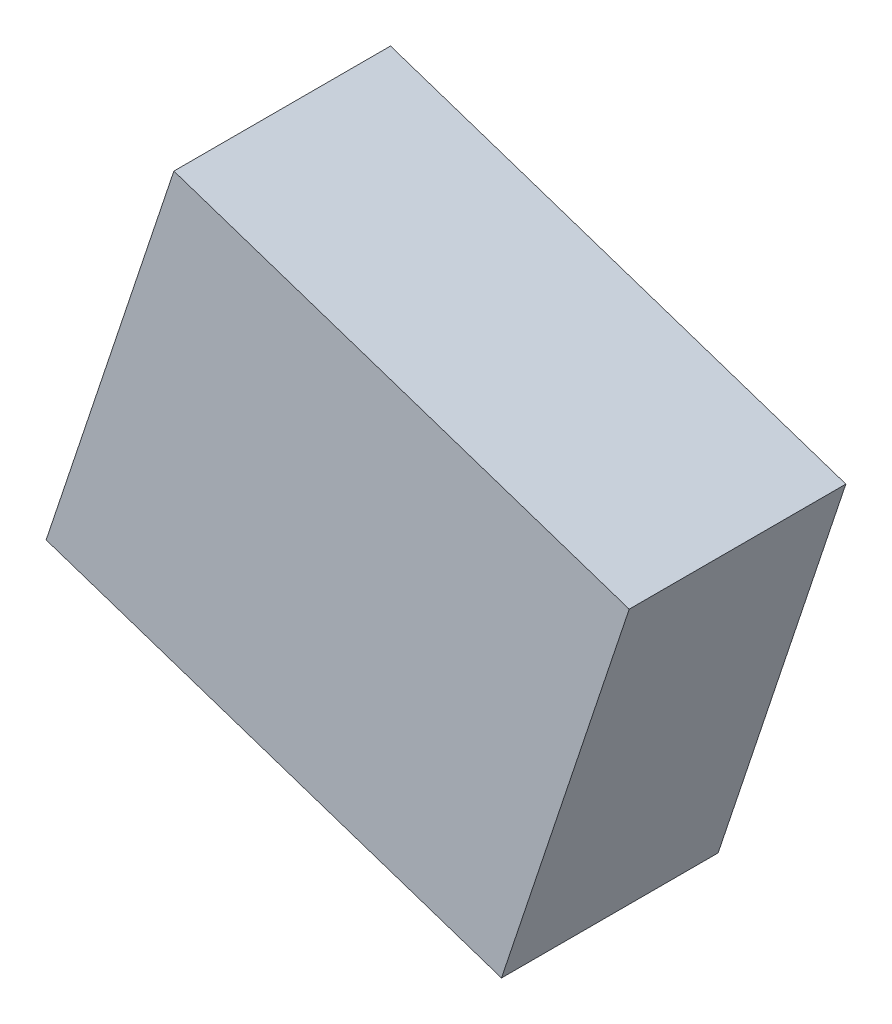
ISO-10303-21;
HEADER;
FILE_DESCRIPTION(('STEP AP214'),'2;1');
FILE_NAME('part.step','',(''),(''),'','','');
FILE_SCHEMA(('AUTOMOTIVE_DESIGN { 1 0 10303 214 1 1 1 1 }'));
ENDSEC;
DATA;
#1=APPLICATION_CONTEXT('core data for automotive mechanical design processes');
#2=APPLICATION_PROTOCOL_DEFINITION('international standard','automotive_design',2000,#1);
#3=PRODUCT_CONTEXT('',#1,'mechanical');
#4=PRODUCT('Part','Part','',(#3));
#5=PRODUCT_RELATED_PRODUCT_CATEGORY('part','',(#4));
#6=PRODUCT_DEFINITION_FORMATION('','',#4);
#7=PRODUCT_DEFINITION_CONTEXT('part definition',#1,'design');
#8=PRODUCT_DEFINITION('design','',#6,#7);
#9=PRODUCT_DEFINITION_SHAPE('','',#8);
#10=(LENGTH_UNIT() NAMED_UNIT(*) SI_UNIT(.MILLI.,.METRE.));
#11=(NAMED_UNIT(*) PLANE_ANGLE_UNIT() SI_UNIT($,.RADIAN.));
#12=(NAMED_UNIT(*) SI_UNIT($,.STERADIAN.) SOLID_ANGLE_UNIT());
#13=UNCERTAINTY_MEASURE_WITH_UNIT(LENGTH_MEASURE(1.E-05),#10,'distance_accuracy_value','');
#14=(GEOMETRIC_REPRESENTATION_CONTEXT(3) GLOBAL_UNCERTAINTY_ASSIGNED_CONTEXT((#13)) GLOBAL_UNIT_ASSIGNED_CONTEXT((#10,
#11,#12)) REPRESENTATION_CONTEXT('',''));
#15=CARTESIAN_POINT('',(0.,0.,0.));
#16=DIRECTION('',(0.,0.,1.));
#17=DIRECTION('',(1.,0.,0.));
#18=AXIS2_PLACEMENT_3D('',#15,#16,#17);
#19=CARTESIAN_POINT('',(41.58386980229,25.8627897643,3.8227));
#20=DIRECTION('',(0.948710608132914,-0.316145823973805,0.));
#21=DIRECTION('',(0.,0.,-1.));
#22=AXIS2_PLACEMENT_3D('',#19,#20,#21);
#23=PLANE('',#22);
#24=DIRECTION('',(0.,0.,1.));
#25=VECTOR('',#24,1.);
#26=CARTESIAN_POINT('',(39.52037399567,19.67051957401,0.32258));
#27=LINE('',#26,#25);
#28=CARTESIAN_POINT('',(39.52037399567,19.67051957401,0.32258));
#29=VERTEX_POINT('',#28);
#30=CARTESIAN_POINT('',(39.52037399567,19.67051957401,3.8227));
#31=VERTEX_POINT('',#30);
#32=EDGE_CURVE('E11',#29,#31,#27,.T.);
#33=ORIENTED_EDGE('',*,*,#32,.T.);
#34=DIRECTION('',(-0.316145823973805,-0.948710608132914,0.));
#35=VECTOR('',#34,1.);
#36=CARTESIAN_POINT('',(41.58386980229,25.8627897643,3.8227));
#37=LINE('',#36,#35);
#38=CARTESIAN_POINT('',(41.58386980229,25.8627897643,3.8227));
#39=VERTEX_POINT('',#38);
#40=EDGE_CURVE('E70',#39,#31,#37,.T.);
#41=ORIENTED_EDGE('',*,*,#40,.F.);
#42=DIRECTION('',(0.,0.,1.));
#43=VECTOR('',#42,1.);
#44=CARTESIAN_POINT('',(41.58386980229,25.8627897643,0.32258));
#45=LINE('',#44,#43);
#46=CARTESIAN_POINT('',(41.58386980229,25.8627897643,0.32258));
#47=VERTEX_POINT('',#46);
#48=EDGE_CURVE('E64',#47,#39,#45,.T.);
#49=ORIENTED_EDGE('',*,*,#48,.F.);
#50=DIRECTION('',(0.316145823973805,0.948710608132914,0.));
#51=VECTOR('',#50,1.);
#52=CARTESIAN_POINT('',(39.52037399567,19.67051957401,0.32258));
#53=LINE('',#52,#51);
#54=EDGE_CURVE('E67',#29,#47,#53,.T.);
#55=ORIENTED_EDGE('',*,*,#54,.F.);
#56=EDGE_LOOP('',(#33,#41,#49,#55));
#57=FACE_BOUND('',#56,.T.);
#58=ADVANCED_FACE('F18',(#57),#23,.F.);
#59=CARTESIAN_POINT('',(39.52037399567,19.67051957401,3.8227));
#60=DIRECTION('',(0.316145823973805,0.948710608132914,0.));
#61=DIRECTION('',(0.,0.,-1.));
#62=AXIS2_PLACEMENT_3D('',#59,#60,#61);
#63=PLANE('',#62);
#64=DIRECTION('',(0.,0.,-1.));
#65=VECTOR('',#64,1.);
#66=CARTESIAN_POINT('',(46.87678230672,17.21908944659,3.8227));
#67=LINE('',#66,#65);
#68=CARTESIAN_POINT('',(46.87678230672,17.21908944659,3.8227));
#69=VERTEX_POINT('',#68);
#70=CARTESIAN_POINT('',(46.87678230672,17.21908944659,0.32258));
#71=VERTEX_POINT('',#70);
#72=EDGE_CURVE('E111',#69,#71,#67,.T.);
#73=ORIENTED_EDGE('',*,*,#72,.F.);
#74=DIRECTION('',(0.948710608132914,-0.316145823973805,0.));
#75=VECTOR('',#74,1.);
#76=CARTESIAN_POINT('',(39.52037399567,19.67051957401,3.8227));
#77=LINE('',#76,#75);
#78=EDGE_CURVE('E27',#31,#69,#77,.T.);
#79=ORIENTED_EDGE('',*,*,#78,.F.);
#80=ORIENTED_EDGE('',*,*,#32,.F.);
#81=DIRECTION('',(-0.948710608132914,0.316145823973805,0.));
#82=VECTOR('',#81,1.);
#83=CARTESIAN_POINT('',(46.87678230672,17.21908944659,0.32258));
#84=LINE('',#83,#82);
#85=EDGE_CURVE('E88',#71,#29,#84,.T.);
#86=ORIENTED_EDGE('',*,*,#85,.F.);
#87=EDGE_LOOP('',(#73,#79,#80,#86));
#88=FACE_BOUND('',#87,.T.);
#89=ADVANCED_FACE('F121',(#88),#63,.F.);
#90=CARTESIAN_POINT('',(0.,0.,3.8227));
#91=DIRECTION('',(0.,0.,1.));
#92=DIRECTION('',(1.,0.,0.));
#93=AXIS2_PLACEMENT_3D('',#90,#91,#92);
#94=PLANE('',#93);
#95=DIRECTION('',(-0.948710608132914,0.316145823973805,0.));
#96=VECTOR('',#95,1.);
#97=CARTESIAN_POINT('',(48.94027811334,23.41135963687,3.8227));
#98=LINE('',#97,#96);
#99=CARTESIAN_POINT('',(48.94027811334,23.41135963687,3.8227));
#100=VERTEX_POINT('',#99);
#101=EDGE_CURVE('E74',#100,#39,#98,.T.);
#102=ORIENTED_EDGE('',*,*,#101,.T.);
#103=ORIENTED_EDGE('',*,*,#40,.T.);
#104=ORIENTED_EDGE('',*,*,#78,.T.);
#105=DIRECTION('',(0.316145823973805,0.948710608132914,0.));
#106=VECTOR('',#105,1.);
#107=CARTESIAN_POINT('',(46.87678230672,17.21908944659,3.8227));
#108=LINE('',#107,#106);
#109=EDGE_CURVE('E107',#69,#100,#108,.T.);
#110=ORIENTED_EDGE('',*,*,#109,.T.);
#111=EDGE_LOOP('',(#102,#103,#104,#110));
#112=FACE_BOUND('',#111,.T.);
#113=ADVANCED_FACE('F103',(#112),#94,.T.);
#114=CARTESIAN_POINT('',(48.94027811334,23.41135963687,3.8227));
#115=DIRECTION('',(-0.316145823973805,-0.948710608132914,0.));
#116=DIRECTION('',(-0.948710608132914,0.316145823973805,0.));
#117=AXIS2_PLACEMENT_3D('',#114,#115,#116);
#118=PLANE('',#117);
#119=ORIENTED_EDGE('',*,*,#48,.T.);
#120=ORIENTED_EDGE('',*,*,#101,.F.);
#121=DIRECTION('',(0.,0.,1.));
#122=VECTOR('',#121,1.);
#123=CARTESIAN_POINT('',(48.94027811334,23.41135963687,0.32258));
#124=LINE('',#123,#122);
#125=CARTESIAN_POINT('',(48.94027811334,23.41135963687,0.32258));
#126=VERTEX_POINT('',#125);
#127=EDGE_CURVE('E81',#126,#100,#124,.T.);
#128=ORIENTED_EDGE('',*,*,#127,.F.);
#129=DIRECTION('',(0.948710608132914,-0.316145823973805,0.));
#130=VECTOR('',#129,1.);
#131=CARTESIAN_POINT('',(41.58386980229,25.8627897643,0.32258));
#132=LINE('',#131,#130);
#133=EDGE_CURVE('E75',#47,#126,#132,.T.);
#134=ORIENTED_EDGE('',*,*,#133,.F.);
#135=EDGE_LOOP('',(#119,#120,#128,#134));
#136=FACE_BOUND('',#135,.T.);
#137=ADVANCED_FACE('F79',(#136),#118,.F.);
#138=CARTESIAN_POINT('',(0.,0.,0.32258));
#139=DIRECTION('',(0.,0.,1.));
#140=DIRECTION('',(1.,0.,0.));
#141=AXIS2_PLACEMENT_3D('',#138,#139,#140);
#142=PLANE('',#141);
#143=ORIENTED_EDGE('',*,*,#85,.T.);
#144=ORIENTED_EDGE('',*,*,#54,.T.);
#145=ORIENTED_EDGE('',*,*,#133,.T.);
#146=DIRECTION('',(-0.316145823973805,-0.948710608132914,0.));
#147=VECTOR('',#146,1.);
#148=CARTESIAN_POINT('',(48.94027811334,23.41135963687,0.32258));
#149=LINE('',#148,#147);
#150=EDGE_CURVE('E93',#126,#71,#149,.T.);
#151=ORIENTED_EDGE('',*,*,#150,.T.);
#152=EDGE_LOOP('',(#143,#144,#145,#151));
#153=FACE_BOUND('',#152,.T.);
#154=ADVANCED_FACE('F87',(#153),#142,.F.);
#155=CARTESIAN_POINT('',(46.87678230672,17.21908944659,3.8227));
#156=DIRECTION('',(-0.948710608132914,0.316145823973805,0.));
#157=DIRECTION('',(0.,0.,1.));
#158=AXIS2_PLACEMENT_3D('',#155,#156,#157);
#159=PLANE('',#158);
#160=ORIENTED_EDGE('',*,*,#127,.T.);
#161=ORIENTED_EDGE('',*,*,#109,.F.);
#162=ORIENTED_EDGE('',*,*,#72,.T.);
#163=ORIENTED_EDGE('',*,*,#150,.F.);
#164=EDGE_LOOP('',(#160,#161,#162,#163));
#165=FACE_BOUND('',#164,.T.);
#166=ADVANCED_FACE('F113',(#165),#159,.F.);
#167=CLOSED_SHELL('',(#58,#89,#113,#137,#154,#166));
#168=MANIFOLD_SOLID_BREP('B1',#167);
#169=ADVANCED_BREP_SHAPE_REPRESENTATION('',(#18,#168),#14);
#170=SHAPE_DEFINITION_REPRESENTATION(#9,#169);
ENDSEC;
END-ISO-10303-21;
